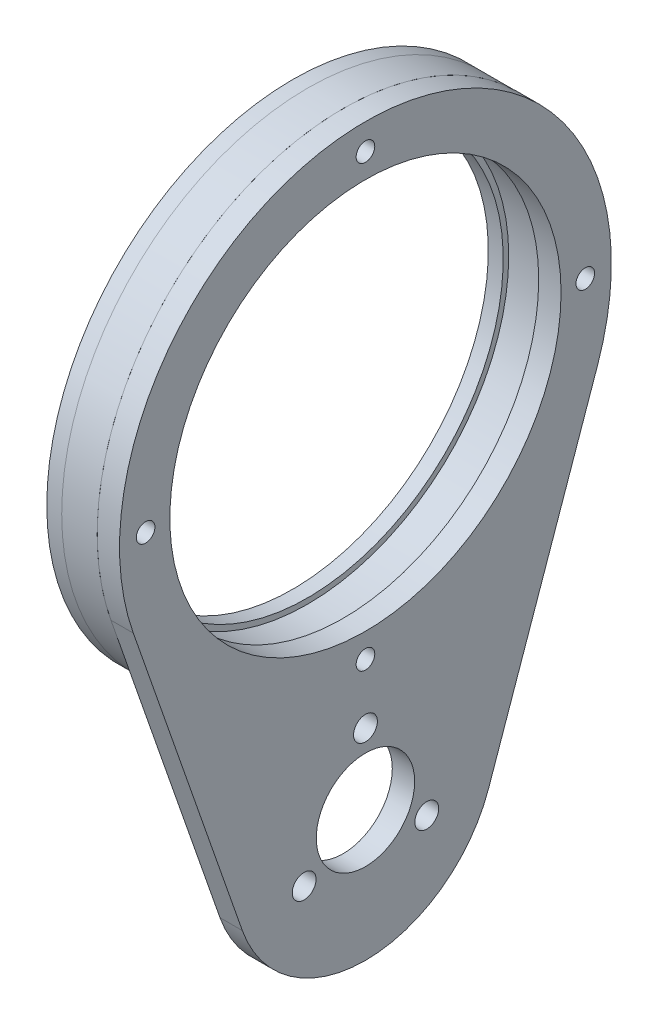
ISO-10303-21;
HEADER;
FILE_DESCRIPTION(('STEP AP214'),'2;1');
FILE_NAME('part.step','',(''),(''),'','','');
FILE_SCHEMA(('AUTOMOTIVE_DESIGN { 1 0 10303 214 1 1 1 1 }'));
ENDSEC;
DATA;
#1=APPLICATION_CONTEXT('core data for automotive mechanical design processes');
#2=APPLICATION_PROTOCOL_DEFINITION('international standard','automotive_design',2000,#1);
#3=PRODUCT_CONTEXT('',#1,'mechanical');
#4=PRODUCT('Part','Part','',(#3));
#5=PRODUCT_RELATED_PRODUCT_CATEGORY('part','',(#4));
#6=PRODUCT_DEFINITION_FORMATION('','',#4);
#7=PRODUCT_DEFINITION_CONTEXT('part definition',#1,'design');
#8=PRODUCT_DEFINITION('design','',#6,#7);
#9=PRODUCT_DEFINITION_SHAPE('','',#8);
#10=(LENGTH_UNIT() NAMED_UNIT(*) SI_UNIT(.MILLI.,.METRE.));
#11=(NAMED_UNIT(*) PLANE_ANGLE_UNIT() SI_UNIT($,.RADIAN.));
#12=(NAMED_UNIT(*) SI_UNIT($,.STERADIAN.) SOLID_ANGLE_UNIT());
#13=UNCERTAINTY_MEASURE_WITH_UNIT(LENGTH_MEASURE(1.E-05),#10,'distance_accuracy_value','');
#14=(GEOMETRIC_REPRESENTATION_CONTEXT(3) GLOBAL_UNCERTAINTY_ASSIGNED_CONTEXT((#13)) GLOBAL_UNIT_ASSIGNED_CONTEXT((#10,
#11,#12)) REPRESENTATION_CONTEXT('',''));
#15=CARTESIAN_POINT('',(0.,0.,0.));
#16=DIRECTION('',(0.,0.,1.));
#17=DIRECTION('',(1.,0.,0.));
#18=AXIS2_PLACEMENT_3D('',#15,#16,#17);
#19=CARTESIAN_POINT('',(-6.763,47.,0.));
#20=DIRECTION('',(-1.,0.,0.));
#21=DIRECTION('',(0.,0.,1.));
#22=AXIS2_PLACEMENT_3D('',#19,#20,#21);
#23=PLANE('',#22);
#24=CARTESIAN_POINT('',(-6.763,47.,-29.5));
#25=DIRECTION('',(-1.,0.,0.));
#26=DIRECTION('',(0.,0.,1.));
#27=AXIS2_PLACEMENT_3D('',#24,#25,#26);
#28=CIRCLE('',#27,1.60000000000001);
#29=CARTESIAN_POINT('',(-6.763,47.,-27.9));
#30=VERTEX_POINT('',#29);
#31=EDGE_CURVE('E74',#30,#30,#28,.T.);
#32=ORIENTED_EDGE('',*,*,#31,.F.);
#33=EDGE_LOOP('',(#32));
#34=FACE_BOUND('',#33,.T.);
#35=CARTESIAN_POINT('',(-6.763,17.5,0.));
#36=DIRECTION('',(-1.,0.,0.));
#37=DIRECTION('',(0.,0.,1.));
#38=AXIS2_PLACEMENT_3D('',#35,#36,#37);
#39=CIRCLE('',#38,1.6);
#40=CARTESIAN_POINT('',(-6.763,17.5,1.6));
#41=VERTEX_POINT('',#40);
#42=EDGE_CURVE('E62',#41,#41,#39,.T.);
#43=ORIENTED_EDGE('',*,*,#42,.F.);
#44=EDGE_LOOP('',(#43));
#45=FACE_BOUND('',#44,.T.);
#46=CARTESIAN_POINT('',(-6.763,47.,0.));
#47=DIRECTION('',(-1.,0.,0.));
#48=DIRECTION('',(0.,0.,1.));
#49=AXIS2_PLACEMENT_3D('',#46,#47,#48);
#50=CIRCLE('',#49,33.);
#51=CARTESIAN_POINT('',(-6.763,47.,33.));
#52=VERTEX_POINT('',#51);
#53=EDGE_CURVE('E11',#52,#52,#50,.T.);
#54=ORIENTED_EDGE('',*,*,#53,.T.);
#55=EDGE_LOOP('',(#54));
#56=FACE_BOUND('',#55,.T.);
#57=CARTESIAN_POINT('',(-6.763,47.,0.));
#58=DIRECTION('',(-1.,0.,0.));
#59=DIRECTION('',(0.,0.,1.));
#60=AXIS2_PLACEMENT_3D('',#57,#58,#59);
#61=CIRCLE('',#60,26.25);
#62=CARTESIAN_POINT('',(-6.763,47.,26.25));
#63=VERTEX_POINT('',#62);
#64=EDGE_CURVE('E57',#63,#63,#61,.T.);
#65=ORIENTED_EDGE('',*,*,#64,.F.);
#66=EDGE_LOOP('',(#65));
#67=FACE_BOUND('',#66,.T.);
#68=CARTESIAN_POINT('',(-6.763,47.,29.5));
#69=DIRECTION('',(-1.,0.,0.));
#70=DIRECTION('',(0.,0.,1.));
#71=AXIS2_PLACEMENT_3D('',#68,#69,#70);
#72=CIRCLE('',#71,1.60000000000001);
#73=CARTESIAN_POINT('',(-6.763,47.,31.1));
#74=VERTEX_POINT('',#73);
#75=EDGE_CURVE('E68',#74,#74,#72,.T.);
#76=ORIENTED_EDGE('',*,*,#75,.F.);
#77=EDGE_LOOP('',(#76));
#78=FACE_BOUND('',#77,.T.);
#79=CARTESIAN_POINT('',(-6.763,76.5,0.));
#80=DIRECTION('',(-1.,0.,0.));
#81=DIRECTION('',(0.,0.,1.));
#82=AXIS2_PLACEMENT_3D('',#79,#80,#81);
#83=CIRCLE('',#82,1.60000000000001);
#84=CARTESIAN_POINT('',(-6.763,76.5,1.60000000000001));
#85=VERTEX_POINT('',#84);
#86=EDGE_CURVE('E80',#85,#85,#83,.T.);
#87=ORIENTED_EDGE('',*,*,#86,.F.);
#88=EDGE_LOOP('',(#87));
#89=FACE_BOUND('',#88,.T.);
#90=ADVANCED_FACE('F46',(#34,#45,#56,#67,#78,#89),#23,.T.);
#91=CARTESIAN_POINT('',(-4.763,47.,0.));
#92=DIRECTION('',(-1.,0.,0.));
#93=DIRECTION('',(0.,0.,1.));
#94=AXIS2_PLACEMENT_3D('',#91,#92,#93);
#95=PLANE('',#94);
#96=CARTESIAN_POINT('',(-4.763,47.,0.));
#97=DIRECTION('',(-1.,0.,0.));
#98=DIRECTION('',(0.,0.,1.));
#99=AXIS2_PLACEMENT_3D('',#96,#97,#98);
#100=CIRCLE('',#99,33.);
#101=CARTESIAN_POINT('',(-4.763,47.,33.));
#102=VERTEX_POINT('',#101);
#103=EDGE_CURVE('E50',#102,#102,#100,.T.);
#104=ORIENTED_EDGE('',*,*,#103,.F.);
#105=EDGE_LOOP('',(#104));
#106=FACE_BOUND('',#105,.T.);
#107=CARTESIAN_POINT('',(-4.763,47.,0.));
#108=DIRECTION('',(-1.,0.,0.));
#109=DIRECTION('',(0.,0.,1.));
#110=AXIS2_PLACEMENT_3D('',#107,#108,#109);
#111=CIRCLE('',#110,26.25);
#112=CARTESIAN_POINT('',(-4.763,47.,26.25));
#113=VERTEX_POINT('',#112);
#114=EDGE_CURVE('E59',#113,#113,#111,.T.);
#115=ORIENTED_EDGE('',*,*,#114,.T.);
#116=EDGE_LOOP('',(#115));
#117=FACE_BOUND('',#116,.T.);
#118=CARTESIAN_POINT('',(-4.763,17.5,0.));
#119=DIRECTION('',(-1.,0.,0.));
#120=DIRECTION('',(0.,0.,1.));
#121=AXIS2_PLACEMENT_3D('',#118,#119,#120);
#122=CIRCLE('',#121,1.6);
#123=CARTESIAN_POINT('',(-4.763,17.5,1.6));
#124=VERTEX_POINT('',#123);
#125=EDGE_CURVE('E65',#124,#124,#122,.T.);
#126=ORIENTED_EDGE('',*,*,#125,.T.);
#127=EDGE_LOOP('',(#126));
#128=FACE_BOUND('',#127,.T.);
#129=CARTESIAN_POINT('',(-4.763,47.,29.5));
#130=DIRECTION('',(-1.,0.,0.));
#131=DIRECTION('',(0.,0.,1.));
#132=AXIS2_PLACEMENT_3D('',#129,#130,#131);
#133=CIRCLE('',#132,1.60000000000001);
#134=CARTESIAN_POINT('',(-4.763,47.,31.1));
#135=VERTEX_POINT('',#134);
#136=EDGE_CURVE('E71',#135,#135,#133,.T.);
#137=ORIENTED_EDGE('',*,*,#136,.T.);
#138=EDGE_LOOP('',(#137));
#139=FACE_BOUND('',#138,.T.);
#140=CARTESIAN_POINT('',(-4.763,47.,-29.5));
#141=DIRECTION('',(-1.,0.,0.));
#142=DIRECTION('',(0.,0.,1.));
#143=AXIS2_PLACEMENT_3D('',#140,#141,#142);
#144=CIRCLE('',#143,1.60000000000001);
#145=CARTESIAN_POINT('',(-4.763,47.,-27.9));
#146=VERTEX_POINT('',#145);
#147=EDGE_CURVE('E77',#146,#146,#144,.T.);
#148=ORIENTED_EDGE('',*,*,#147,.T.);
#149=EDGE_LOOP('',(#148));
#150=FACE_BOUND('',#149,.T.);
#151=CARTESIAN_POINT('',(-4.763,76.5,0.));
#152=DIRECTION('',(-1.,0.,0.));
#153=DIRECTION('',(0.,0.,1.));
#154=AXIS2_PLACEMENT_3D('',#151,#152,#153);
#155=CIRCLE('',#154,1.60000000000001);
#156=CARTESIAN_POINT('',(-4.763,76.5,1.60000000000001));
#157=VERTEX_POINT('',#156);
#158=EDGE_CURVE('E83',#157,#157,#155,.T.);
#159=ORIENTED_EDGE('',*,*,#158,.T.);
#160=EDGE_LOOP('',(#159));
#161=FACE_BOUND('',#160,.T.);
#162=ADVANCED_FACE('F93',(#106,#117,#128,#139,#150,#161),#95,.F.);
#163=CARTESIAN_POINT('',(-6.763,47.,0.));
#164=DIRECTION('',(1.,0.,0.));
#165=DIRECTION('',(0.,0.,-1.));
#166=AXIS2_PLACEMENT_3D('',#163,#164,#165);
#167=CYLINDRICAL_SURFACE('',#166,33.);
#168=ORIENTED_EDGE('',*,*,#53,.F.);
#169=EDGE_LOOP('',(#168));
#170=FACE_BOUND('',#169,.T.);
#171=ORIENTED_EDGE('',*,*,#103,.T.);
#172=EDGE_LOOP('',(#171));
#173=FACE_BOUND('',#172,.T.);
#174=ADVANCED_FACE('F48',(#170,#173),#167,.T.);
#175=CARTESIAN_POINT('',(-6.763,47.,0.));
#176=DIRECTION('',(1.,0.,0.));
#177=DIRECTION('',(0.,0.,-1.));
#178=AXIS2_PLACEMENT_3D('',#175,#176,#177);
#179=CYLINDRICAL_SURFACE('',#178,26.25);
#180=ORIENTED_EDGE('',*,*,#64,.T.);
#181=EDGE_LOOP('',(#180));
#182=FACE_BOUND('',#181,.T.);
#183=ORIENTED_EDGE('',*,*,#114,.F.);
#184=EDGE_LOOP('',(#183));
#185=FACE_BOUND('',#184,.T.);
#186=ADVANCED_FACE('F103',(#182,#185),#179,.F.);
#187=CARTESIAN_POINT('',(-6.763,17.5,0.));
#188=DIRECTION('',(1.,0.,0.));
#189=DIRECTION('',(0.,0.,-1.));
#190=AXIS2_PLACEMENT_3D('',#187,#188,#189);
#191=CYLINDRICAL_SURFACE('',#190,1.6);
#192=ORIENTED_EDGE('',*,*,#42,.T.);
#193=EDGE_LOOP('',(#192));
#194=FACE_BOUND('',#193,.T.);
#195=ORIENTED_EDGE('',*,*,#125,.F.);
#196=EDGE_LOOP('',(#195));
#197=FACE_BOUND('',#196,.T.);
#198=ADVANCED_FACE('F106',(#194,#197),#191,.F.);
#199=CARTESIAN_POINT('',(-6.763,47.,29.5));
#200=DIRECTION('',(1.,0.,0.));
#201=DIRECTION('',(0.,0.,-1.));
#202=AXIS2_PLACEMENT_3D('',#199,#200,#201);
#203=CYLINDRICAL_SURFACE('',#202,1.60000000000001);
#204=ORIENTED_EDGE('',*,*,#75,.T.);
#205=EDGE_LOOP('',(#204));
#206=FACE_BOUND('',#205,.T.);
#207=ORIENTED_EDGE('',*,*,#136,.F.);
#208=EDGE_LOOP('',(#207));
#209=FACE_BOUND('',#208,.T.);
#210=ADVANCED_FACE('F110',(#206,#209),#203,.F.);
#211=CARTESIAN_POINT('',(-6.763,47.,-29.5));
#212=DIRECTION('',(1.,0.,0.));
#213=DIRECTION('',(0.,0.,-1.));
#214=AXIS2_PLACEMENT_3D('',#211,#212,#213);
#215=CYLINDRICAL_SURFACE('',#214,1.60000000000001);
#216=ORIENTED_EDGE('',*,*,#31,.T.);
#217=EDGE_LOOP('',(#216));
#218=FACE_BOUND('',#217,.T.);
#219=ORIENTED_EDGE('',*,*,#147,.F.);
#220=EDGE_LOOP('',(#219));
#221=FACE_BOUND('',#220,.T.);
#222=ADVANCED_FACE('F114',(#218,#221),#215,.F.);
#223=CARTESIAN_POINT('',(-6.763,76.5,0.));
#224=DIRECTION('',(1.,0.,0.));
#225=DIRECTION('',(0.,0.,-1.));
#226=AXIS2_PLACEMENT_3D('',#223,#224,#225);
#227=CYLINDRICAL_SURFACE('',#226,1.60000000000001);
#228=ORIENTED_EDGE('',*,*,#86,.T.);
#229=EDGE_LOOP('',(#228));
#230=FACE_BOUND('',#229,.T.);
#231=ORIENTED_EDGE('',*,*,#158,.F.);
#232=EDGE_LOOP('',(#231));
#233=FACE_BOUND('',#232,.T.);
#234=ADVANCED_FACE('F89',(#230,#233),#227,.F.);
#235=CLOSED_SHELL('',(#90,#162,#174,#186,#198,#210,#222,#234));
#236=MANIFOLD_SOLID_BREP('B2',#235);
#237=CARTESIAN_POINT('',(-4.763,47.,0.));
#238=DIRECTION('',(-1.,0.,0.));
#239=DIRECTION('',(0.,0.,1.));
#240=AXIS2_PLACEMENT_3D('',#237,#238,#239);
#241=PLANE('',#240);
#242=CARTESIAN_POINT('',(-4.763,17.5,0.));
#243=DIRECTION('',(-1.,0.,0.));
#244=DIRECTION('',(0.,0.,1.));
#245=AXIS2_PLACEMENT_3D('',#242,#243,#244);
#246=CIRCLE('',#245,1.6);
#247=CARTESIAN_POINT('',(-4.763,17.5,1.6));
#248=VERTEX_POINT('',#247);
#249=EDGE_CURVE('E229',#248,#248,#246,.T.);
#250=ORIENTED_EDGE('',*,*,#249,.F.);
#251=EDGE_LOOP('',(#250));
#252=FACE_BOUND('',#251,.T.);
#253=CARTESIAN_POINT('',(-4.763,76.5,0.));
#254=DIRECTION('',(-1.,0.,0.));
#255=DIRECTION('',(0.,0.,1.));
#256=AXIS2_PLACEMENT_3D('',#253,#254,#255);
#257=CIRCLE('',#256,1.60000000000001);
#258=CARTESIAN_POINT('',(-4.763,76.5,1.60000000000001));
#259=VERTEX_POINT('',#258);
#260=EDGE_CURVE('E217',#259,#259,#257,.T.);
#261=ORIENTED_EDGE('',*,*,#260,.F.);
#262=EDGE_LOOP('',(#261));
#263=FACE_BOUND('',#262,.T.);
#264=CARTESIAN_POINT('',(-4.763,47.,0.));
#265=DIRECTION('',(-1.,0.,0.));
#266=DIRECTION('',(0.,0.,1.));
#267=AXIS2_PLACEMENT_3D('',#264,#265,#266);
#268=CIRCLE('',#267,33.);
#269=CARTESIAN_POINT('',(-4.763,47.,33.));
#270=VERTEX_POINT('',#269);
#271=EDGE_CURVE('E45',#270,#270,#268,.T.);
#272=ORIENTED_EDGE('',*,*,#271,.T.);
#273=EDGE_LOOP('',(#272));
#274=FACE_BOUND('',#273,.T.);
#275=CARTESIAN_POINT('',(-4.763,47.,0.));
#276=DIRECTION('',(-1.,0.,0.));
#277=DIRECTION('',(0.,0.,1.));
#278=AXIS2_PLACEMENT_3D('',#275,#276,#277);
#279=CIRCLE('',#278,26.9875);
#280=CARTESIAN_POINT('',(-4.763,47.,26.9875));
#281=VERTEX_POINT('',#280);
#282=EDGE_CURVE('E212',#281,#281,#279,.T.);
#283=ORIENTED_EDGE('',*,*,#282,.F.);
#284=EDGE_LOOP('',(#283));
#285=FACE_BOUND('',#284,.T.);
#286=CARTESIAN_POINT('',(-4.763,47.,29.5));
#287=DIRECTION('',(-1.,0.,0.));
#288=DIRECTION('',(0.,0.,1.));
#289=AXIS2_PLACEMENT_3D('',#286,#287,#288);
#290=CIRCLE('',#289,1.60000000000001);
#291=CARTESIAN_POINT('',(-4.763,47.,31.1));
#292=VERTEX_POINT('',#291);
#293=EDGE_CURVE('E223',#292,#292,#290,.T.);
#294=ORIENTED_EDGE('',*,*,#293,.F.);
#295=EDGE_LOOP('',(#294));
#296=FACE_BOUND('',#295,.T.);
#297=CARTESIAN_POINT('',(-4.763,47.,-29.5));
#298=DIRECTION('',(-1.,0.,0.));
#299=DIRECTION('',(0.,0.,1.));
#300=AXIS2_PLACEMENT_3D('',#297,#298,#299);
#301=CIRCLE('',#300,1.60000000000001);
#302=CARTESIAN_POINT('',(-4.763,47.,-27.9));
#303=VERTEX_POINT('',#302);
#304=EDGE_CURVE('E235',#303,#303,#301,.T.);
#305=ORIENTED_EDGE('',*,*,#304,.F.);
#306=EDGE_LOOP('',(#305));
#307=FACE_BOUND('',#306,.T.);
#308=ADVANCED_FACE('F201',(#252,#263,#274,#285,#296,#307),#241,.T.);
#309=CARTESIAN_POINT('',(0.,47.,0.));
#310=DIRECTION('',(-1.,0.,0.));
#311=DIRECTION('',(0.,0.,1.));
#312=AXIS2_PLACEMENT_3D('',#309,#310,#311);
#313=PLANE('',#312);
#314=CARTESIAN_POINT('',(0.,47.,0.));
#315=DIRECTION('',(-1.,0.,0.));
#316=DIRECTION('',(0.,0.,1.));
#317=AXIS2_PLACEMENT_3D('',#314,#315,#316);
#318=CIRCLE('',#317,33.);
#319=CARTESIAN_POINT('',(0.,47.,33.));
#320=VERTEX_POINT('',#319);
#321=EDGE_CURVE('E205',#320,#320,#318,.T.);
#322=ORIENTED_EDGE('',*,*,#321,.F.);
#323=EDGE_LOOP('',(#322));
#324=FACE_BOUND('',#323,.T.);
#325=CARTESIAN_POINT('',(0.,47.,0.));
#326=DIRECTION('',(-1.,0.,0.));
#327=DIRECTION('',(0.,0.,1.));
#328=AXIS2_PLACEMENT_3D('',#325,#326,#327);
#329=CIRCLE('',#328,26.9875);
#330=CARTESIAN_POINT('',(0.,47.,26.9875));
#331=VERTEX_POINT('',#330);
#332=EDGE_CURVE('E214',#331,#331,#329,.T.);
#333=ORIENTED_EDGE('',*,*,#332,.T.);
#334=EDGE_LOOP('',(#333));
#335=FACE_BOUND('',#334,.T.);
#336=CARTESIAN_POINT('',(0.,76.5,0.));
#337=DIRECTION('',(-1.,0.,0.));
#338=DIRECTION('',(0.,0.,1.));
#339=AXIS2_PLACEMENT_3D('',#336,#337,#338);
#340=CIRCLE('',#339,1.60000000000001);
#341=CARTESIAN_POINT('',(0.,76.5,1.60000000000001));
#342=VERTEX_POINT('',#341);
#343=EDGE_CURVE('E220',#342,#342,#340,.T.);
#344=ORIENTED_EDGE('',*,*,#343,.T.);
#345=EDGE_LOOP('',(#344));
#346=FACE_BOUND('',#345,.T.);
#347=CARTESIAN_POINT('',(0.,47.,29.5));
#348=DIRECTION('',(-1.,0.,0.));
#349=DIRECTION('',(0.,0.,1.));
#350=AXIS2_PLACEMENT_3D('',#347,#348,#349);
#351=CIRCLE('',#350,1.60000000000001);
#352=CARTESIAN_POINT('',(0.,47.,31.1));
#353=VERTEX_POINT('',#352);
#354=EDGE_CURVE('E226',#353,#353,#351,.T.);
#355=ORIENTED_EDGE('',*,*,#354,.T.);
#356=EDGE_LOOP('',(#355));
#357=FACE_BOUND('',#356,.T.);
#358=CARTESIAN_POINT('',(0.,17.5,0.));
#359=DIRECTION('',(-1.,0.,0.));
#360=DIRECTION('',(0.,0.,1.));
#361=AXIS2_PLACEMENT_3D('',#358,#359,#360);
#362=CIRCLE('',#361,1.6);
#363=CARTESIAN_POINT('',(0.,17.5,1.6));
#364=VERTEX_POINT('',#363);
#365=EDGE_CURVE('E232',#364,#364,#362,.T.);
#366=ORIENTED_EDGE('',*,*,#365,.T.);
#367=EDGE_LOOP('',(#366));
#368=FACE_BOUND('',#367,.T.);
#369=CARTESIAN_POINT('',(0.,47.,-29.5));
#370=DIRECTION('',(-1.,0.,0.));
#371=DIRECTION('',(0.,0.,1.));
#372=AXIS2_PLACEMENT_3D('',#369,#370,#371);
#373=CIRCLE('',#372,1.60000000000001);
#374=CARTESIAN_POINT('',(0.,47.,-27.9));
#375=VERTEX_POINT('',#374);
#376=EDGE_CURVE('E238',#375,#375,#373,.T.);
#377=ORIENTED_EDGE('',*,*,#376,.T.);
#378=EDGE_LOOP('',(#377));
#379=FACE_BOUND('',#378,.T.);
#380=ADVANCED_FACE('F248',(#324,#335,#346,#357,#368,#379),#313,.F.);
#381=CARTESIAN_POINT('',(-4.763,47.,0.));
#382=DIRECTION('',(1.,0.,0.));
#383=DIRECTION('',(0.,0.,-1.));
#384=AXIS2_PLACEMENT_3D('',#381,#382,#383);
#385=CYLINDRICAL_SURFACE('',#384,33.);
#386=ORIENTED_EDGE('',*,*,#271,.F.);
#387=EDGE_LOOP('',(#386));
#388=FACE_BOUND('',#387,.T.);
#389=ORIENTED_EDGE('',*,*,#321,.T.);
#390=EDGE_LOOP('',(#389));
#391=FACE_BOUND('',#390,.T.);
#392=ADVANCED_FACE('F203',(#388,#391),#385,.T.);
#393=CARTESIAN_POINT('',(-4.763,47.,0.));
#394=DIRECTION('',(1.,0.,0.));
#395=DIRECTION('',(0.,0.,-1.));
#396=AXIS2_PLACEMENT_3D('',#393,#394,#395);
#397=CYLINDRICAL_SURFACE('',#396,26.9875);
#398=ORIENTED_EDGE('',*,*,#282,.T.);
#399=EDGE_LOOP('',(#398));
#400=FACE_BOUND('',#399,.T.);
#401=ORIENTED_EDGE('',*,*,#332,.F.);
#402=EDGE_LOOP('',(#401));
#403=FACE_BOUND('',#402,.T.);
#404=ADVANCED_FACE('F258',(#400,#403),#397,.F.);
#405=CARTESIAN_POINT('',(-4.763,76.5,0.));
#406=DIRECTION('',(1.,0.,0.));
#407=DIRECTION('',(0.,0.,-1.));
#408=AXIS2_PLACEMENT_3D('',#405,#406,#407);
#409=CYLINDRICAL_SURFACE('',#408,1.60000000000001);
#410=ORIENTED_EDGE('',*,*,#260,.T.);
#411=EDGE_LOOP('',(#410));
#412=FACE_BOUND('',#411,.T.);
#413=ORIENTED_EDGE('',*,*,#343,.F.);
#414=EDGE_LOOP('',(#413));
#415=FACE_BOUND('',#414,.T.);
#416=ADVANCED_FACE('F261',(#412,#415),#409,.F.);
#417=CARTESIAN_POINT('',(-4.763,47.,29.5));
#418=DIRECTION('',(1.,0.,0.));
#419=DIRECTION('',(0.,0.,-1.));
#420=AXIS2_PLACEMENT_3D('',#417,#418,#419);
#421=CYLINDRICAL_SURFACE('',#420,1.60000000000001);
#422=ORIENTED_EDGE('',*,*,#293,.T.);
#423=EDGE_LOOP('',(#422));
#424=FACE_BOUND('',#423,.T.);
#425=ORIENTED_EDGE('',*,*,#354,.F.);
#426=EDGE_LOOP('',(#425));
#427=FACE_BOUND('',#426,.T.);
#428=ADVANCED_FACE('F265',(#424,#427),#421,.F.);
#429=CARTESIAN_POINT('',(-4.763,17.5,0.));
#430=DIRECTION('',(1.,0.,0.));
#431=DIRECTION('',(0.,0.,-1.));
#432=AXIS2_PLACEMENT_3D('',#429,#430,#431);
#433=CYLINDRICAL_SURFACE('',#432,1.6);
#434=ORIENTED_EDGE('',*,*,#249,.T.);
#435=EDGE_LOOP('',(#434));
#436=FACE_BOUND('',#435,.T.);
#437=ORIENTED_EDGE('',*,*,#365,.F.);
#438=EDGE_LOOP('',(#437));
#439=FACE_BOUND('',#438,.T.);
#440=ADVANCED_FACE('F269',(#436,#439),#433,.F.);
#441=CARTESIAN_POINT('',(-4.763,47.,-29.5));
#442=DIRECTION('',(1.,0.,0.));
#443=DIRECTION('',(0.,0.,-1.));
#444=AXIS2_PLACEMENT_3D('',#441,#442,#443);
#445=CYLINDRICAL_SURFACE('',#444,1.60000000000001);
#446=ORIENTED_EDGE('',*,*,#304,.T.);
#447=EDGE_LOOP('',(#446));
#448=FACE_BOUND('',#447,.T.);
#449=ORIENTED_EDGE('',*,*,#376,.F.);
#450=EDGE_LOOP('',(#449));
#451=FACE_BOUND('',#450,.T.);
#452=ADVANCED_FACE('F244',(#448,#451),#445,.F.);
#453=CLOSED_SHELL('',(#308,#380,#392,#404,#416,#428,#440,#452));
#454=MANIFOLD_SOLID_BREP('B6',#453);
#455=CARTESIAN_POINT('',(3.,47.,0.));
#456=DIRECTION('',(1.,0.,0.));
#457=DIRECTION('',(0.,0.,-1.));
#458=AXIS2_PLACEMENT_3D('',#455,#456,#457);
#459=PLANE('',#458);
#460=CARTESIAN_POINT('',(3.,47.,-29.5));
#461=DIRECTION('',(1.,0.,0.));
#462=DIRECTION('',(0.,0.,-1.));
#463=AXIS2_PLACEMENT_3D('',#460,#461,#462);
#464=CIRCLE('',#463,1.25);
#465=CARTESIAN_POINT('',(3.,47.,-30.75));
#466=VERTEX_POINT('',#465);
#467=EDGE_CURVE('E465',#466,#466,#464,.T.);
#468=ORIENTED_EDGE('',*,*,#467,.F.);
#469=EDGE_LOOP('',(#468));
#470=FACE_BOUND('',#469,.T.);
#471=CARTESIAN_POINT('',(3.,76.5,0.));
#472=DIRECTION('',(1.,0.,0.));
#473=DIRECTION('',(0.,0.,-1.));
#474=AXIS2_PLACEMENT_3D('',#471,#472,#473);
#475=CIRCLE('',#474,1.25);
#476=CARTESIAN_POINT('',(3.,76.5,-1.25));
#477=VERTEX_POINT('',#476);
#478=EDGE_CURVE('E453',#477,#477,#475,.T.);
#479=ORIENTED_EDGE('',*,*,#478,.F.);
#480=EDGE_LOOP('',(#479));
#481=FACE_BOUND('',#480,.T.);
#482=CARTESIAN_POINT('',(3.,-4.75,8.22724133595217));
#483=DIRECTION('',(1.,0.,0.));
#484=DIRECTION('',(0.,0.,-1.));
#485=AXIS2_PLACEMENT_3D('',#482,#483,#484);
#486=CIRCLE('',#485,1.6);
#487=CARTESIAN_POINT('',(3.,-4.75,6.62724133595217));
#488=VERTEX_POINT('',#487);
#489=EDGE_CURVE('E441',#488,#488,#486,.T.);
#490=ORIENTED_EDGE('',*,*,#489,.F.);
#491=EDGE_LOOP('',(#490));
#492=FACE_BOUND('',#491,.T.);
#493=CARTESIAN_POINT('',(3.,9.5,0.));
#494=DIRECTION('',(1.,0.,0.));
#495=DIRECTION('',(0.,0.,-1.));
#496=AXIS2_PLACEMENT_3D('',#493,#494,#495);
#497=CIRCLE('',#496,1.6);
#498=CARTESIAN_POINT('',(3.,9.5,-1.6));
#499=VERTEX_POINT('',#498);
#500=EDGE_CURVE('E429',#499,#499,#497,.T.);
#501=ORIENTED_EDGE('',*,*,#500,.F.);
#502=EDGE_LOOP('',(#501));
#503=FACE_BOUND('',#502,.T.);
#504=CARTESIAN_POINT('',(3.,47.,0.));
#505=DIRECTION('',(1.,0.,0.));
#506=DIRECTION('',(0.,0.,-1.));
#507=AXIS2_PLACEMENT_3D('',#504,#505,#506);
#508=CIRCLE('',#507,33.);
#509=CARTESIAN_POINT('',(3.,36.1170212765957,-31.1538243897267));
#510=VERTEX_POINT('',#509);
#511=CARTESIAN_POINT('',(3.,36.1170212765957,31.1538243897267));
#512=VERTEX_POINT('',#511);
#513=EDGE_CURVE('E399',#510,#512,#508,.T.);
#514=ORIENTED_EDGE('',*,*,#513,.T.);
#515=DIRECTION('',(0.,-0.944055284537173,-0.329787234042554));
#516=VECTOR('',#515,1.);
#517=CARTESIAN_POINT('',(3.,36.1170212765957,31.1538243897267));
#518=LINE('',#517,#516);
#519=CARTESIAN_POINT('',(3.,-5.77127659574468,16.5209674794005));
#520=VERTEX_POINT('',#519);
#521=EDGE_CURVE('E394',#512,#520,#518,.T.);
#522=ORIENTED_EDGE('',*,*,#521,.T.);
#523=CARTESIAN_POINT('',(3.,0.,0.));
#524=DIRECTION('',(1.,0.,0.));
#525=DIRECTION('',(0.,0.,-1.));
#526=AXIS2_PLACEMENT_3D('',#523,#524,#525);
#527=CIRCLE('',#526,17.5);
#528=CARTESIAN_POINT('',(3.,-5.77127659574469,-16.5209674794005));
#529=VERTEX_POINT('',#528);
#530=EDGE_CURVE('E397',#520,#529,#527,.T.);
#531=ORIENTED_EDGE('',*,*,#530,.T.);
#532=DIRECTION('',(0.,0.944055284537173,-0.329787234042554));
#533=VECTOR('',#532,1.);
#534=CARTESIAN_POINT('',(3.,36.1170212765957,-31.1538243897267));
#535=LINE('',#534,#533);
#536=EDGE_CURVE('E364',#529,#510,#535,.T.);
#537=ORIENTED_EDGE('',*,*,#536,.T.);
#538=EDGE_LOOP('',(#514,#522,#531,#537));
#539=FACE_BOUND('',#538,.T.);
#540=CARTESIAN_POINT('',(3.,0.,0.));
#541=DIRECTION('',(1.,0.,0.));
#542=DIRECTION('',(0.,0.,-1.));
#543=AXIS2_PLACEMENT_3D('',#540,#541,#542);
#544=CIRCLE('',#543,6.6);
#545=CARTESIAN_POINT('',(3.,0.,-6.6));
#546=VERTEX_POINT('',#545);
#547=EDGE_CURVE('E414',#546,#546,#544,.T.);
#548=ORIENTED_EDGE('',*,*,#547,.F.);
#549=EDGE_LOOP('',(#548));
#550=FACE_BOUND('',#549,.T.);
#551=CARTESIAN_POINT('',(3.,-4.75,-8.22724133595217));
#552=DIRECTION('',(1.,0.,0.));
#553=DIRECTION('',(0.,0.,-1.));
#554=AXIS2_PLACEMENT_3D('',#551,#552,#553);
#555=CIRCLE('',#554,1.6);
#556=CARTESIAN_POINT('',(3.,-4.75,-9.82724133595217));
#557=VERTEX_POINT('',#556);
#558=EDGE_CURVE('E435',#557,#557,#555,.T.);
#559=ORIENTED_EDGE('',*,*,#558,.F.);
#560=EDGE_LOOP('',(#559));
#561=FACE_BOUND('',#560,.T.);
#562=CARTESIAN_POINT('',(3.,47.,0.));
#563=DIRECTION('',(1.,0.,0.));
#564=DIRECTION('',(0.,0.,-1.));
#565=AXIS2_PLACEMENT_3D('',#562,#563,#564);
#566=CIRCLE('',#565,26.25);
#567=CARTESIAN_POINT('',(3.,47.,-26.25));
#568=VERTEX_POINT('',#567);
#569=EDGE_CURVE('E447',#568,#568,#566,.T.);
#570=ORIENTED_EDGE('',*,*,#569,.F.);
#571=EDGE_LOOP('',(#570));
#572=FACE_BOUND('',#571,.T.);
#573=CARTESIAN_POINT('',(3.,17.5,0.));
#574=DIRECTION('',(1.,0.,0.));
#575=DIRECTION('',(0.,0.,-1.));
#576=AXIS2_PLACEMENT_3D('',#573,#574,#575);
#577=CIRCLE('',#576,1.25);
#578=CARTESIAN_POINT('',(3.,17.5,-1.25));
#579=VERTEX_POINT('',#578);
#580=EDGE_CURVE('E459',#579,#579,#577,.T.);
#581=ORIENTED_EDGE('',*,*,#580,.F.);
#582=EDGE_LOOP('',(#581));
#583=FACE_BOUND('',#582,.T.);
#584=CARTESIAN_POINT('',(3.,47.,29.5));
#585=DIRECTION('',(1.,0.,0.));
#586=DIRECTION('',(0.,0.,-1.));
#587=AXIS2_PLACEMENT_3D('',#584,#585,#586);
#588=CIRCLE('',#587,1.25);
#589=CARTESIAN_POINT('',(3.,47.,28.25));
#590=VERTEX_POINT('',#589);
#591=EDGE_CURVE('E471',#590,#590,#588,.T.);
#592=ORIENTED_EDGE('',*,*,#591,.F.);
#593=EDGE_LOOP('',(#592));
#594=FACE_BOUND('',#593,.T.);
#595=ADVANCED_FACE('F347',(#470,#481,#492,#503,#539,#550,#561,#572,#583,#594),#459,.T.);
#596=CARTESIAN_POINT('',(0.,47.,0.));
#597=DIRECTION('',(1.,0.,0.));
#598=DIRECTION('',(0.,0.,-1.));
#599=AXIS2_PLACEMENT_3D('',#596,#597,#598);
#600=PLANE('',#599);
#601=CARTESIAN_POINT('',(0.,47.,0.));
#602=DIRECTION('',(1.,0.,0.));
#603=DIRECTION('',(0.,0.,-1.));
#604=AXIS2_PLACEMENT_3D('',#601,#602,#603);
#605=CIRCLE('',#604,33.);
#606=CARTESIAN_POINT('',(0.,36.1170212765957,-31.1538243897267));
#607=VERTEX_POINT('',#606);
#608=CARTESIAN_POINT('',(0.,36.1170212765957,31.1538243897267));
#609=VERTEX_POINT('',#608);
#610=EDGE_CURVE('E411',#607,#609,#605,.T.);
#611=ORIENTED_EDGE('',*,*,#610,.F.);
#612=DIRECTION('',(0.,0.944055284537173,-0.329787234042554));
#613=VECTOR('',#612,1.);
#614=CARTESIAN_POINT('',(0.,36.1170212765957,-31.1538243897267));
#615=LINE('',#614,#613);
#616=CARTESIAN_POINT('',(0.,-5.77127659574469,-16.5209674794005));
#617=VERTEX_POINT('',#616);
#618=EDGE_CURVE('E387',#617,#607,#615,.T.);
#619=ORIENTED_EDGE('',*,*,#618,.F.);
#620=CARTESIAN_POINT('',(0.,0.,0.));
#621=DIRECTION('',(1.,0.,0.));
#622=DIRECTION('',(0.,0.,-1.));
#623=AXIS2_PLACEMENT_3D('',#620,#621,#622);
#624=CIRCLE('',#623,17.5);
#625=CARTESIAN_POINT('',(0.,-5.77127659574468,16.5209674794005));
#626=VERTEX_POINT('',#625);
#627=EDGE_CURVE('E381',#626,#617,#624,.T.);
#628=ORIENTED_EDGE('',*,*,#627,.F.);
#629=DIRECTION('',(0.,-0.944055284537173,-0.329787234042554));
#630=VECTOR('',#629,1.);
#631=CARTESIAN_POINT('',(0.,36.1170212765957,31.1538243897267));
#632=LINE('',#631,#630);
#633=EDGE_CURVE('E403',#609,#626,#632,.T.);
#634=ORIENTED_EDGE('',*,*,#633,.F.);
#635=EDGE_LOOP('',(#611,#619,#628,#634));
#636=FACE_BOUND('',#635,.T.);
#637=CARTESIAN_POINT('',(0.,0.,0.));
#638=DIRECTION('',(1.,0.,0.));
#639=DIRECTION('',(0.,0.,-1.));
#640=AXIS2_PLACEMENT_3D('',#637,#638,#639);
#641=CIRCLE('',#640,6.6);
#642=CARTESIAN_POINT('',(0.,0.,-6.6));
#643=VERTEX_POINT('',#642);
#644=EDGE_CURVE('E426',#643,#643,#641,.T.);
#645=ORIENTED_EDGE('',*,*,#644,.T.);
#646=EDGE_LOOP('',(#645));
#647=FACE_BOUND('',#646,.T.);
#648=CARTESIAN_POINT('',(0.,9.5,0.));
#649=DIRECTION('',(1.,0.,0.));
#650=DIRECTION('',(0.,0.,-1.));
#651=AXIS2_PLACEMENT_3D('',#648,#649,#650);
#652=CIRCLE('',#651,1.6);
#653=CARTESIAN_POINT('',(0.,9.5,-1.6));
#654=VERTEX_POINT('',#653);
#655=EDGE_CURVE('E432',#654,#654,#652,.T.);
#656=ORIENTED_EDGE('',*,*,#655,.T.);
#657=EDGE_LOOP('',(#656));
#658=FACE_BOUND('',#657,.T.);
#659=CARTESIAN_POINT('',(0.,-4.75,-8.22724133595217));
#660=DIRECTION('',(1.,0.,0.));
#661=DIRECTION('',(0.,0.,-1.));
#662=AXIS2_PLACEMENT_3D('',#659,#660,#661);
#663=CIRCLE('',#662,1.6);
#664=CARTESIAN_POINT('',(0.,-4.75,-9.82724133595217));
#665=VERTEX_POINT('',#664);
#666=EDGE_CURVE('E438',#665,#665,#663,.T.);
#667=ORIENTED_EDGE('',*,*,#666,.T.);
#668=EDGE_LOOP('',(#667));
#669=FACE_BOUND('',#668,.T.);
#670=CARTESIAN_POINT('',(0.,-4.75,8.22724133595217));
#671=DIRECTION('',(1.,0.,0.));
#672=DIRECTION('',(0.,0.,-1.));
#673=AXIS2_PLACEMENT_3D('',#670,#671,#672);
#674=CIRCLE('',#673,1.6);
#675=CARTESIAN_POINT('',(0.,-4.75,6.62724133595217));
#676=VERTEX_POINT('',#675);
#677=EDGE_CURVE('E444',#676,#676,#674,.T.);
#678=ORIENTED_EDGE('',*,*,#677,.T.);
#679=EDGE_LOOP('',(#678));
#680=FACE_BOUND('',#679,.T.);
#681=CARTESIAN_POINT('',(0.,47.,0.));
#682=DIRECTION('',(1.,0.,0.));
#683=DIRECTION('',(0.,0.,-1.));
#684=AXIS2_PLACEMENT_3D('',#681,#682,#683);
#685=CIRCLE('',#684,26.25);
#686=CARTESIAN_POINT('',(0.,47.,-26.25));
#687=VERTEX_POINT('',#686);
#688=EDGE_CURVE('E450',#687,#687,#685,.T.);
#689=ORIENTED_EDGE('',*,*,#688,.T.);
#690=EDGE_LOOP('',(#689));
#691=FACE_BOUND('',#690,.T.);
#692=CARTESIAN_POINT('',(0.,76.5,0.));
#693=DIRECTION('',(1.,0.,0.));
#694=DIRECTION('',(0.,0.,-1.));
#695=AXIS2_PLACEMENT_3D('',#692,#693,#694);
#696=CIRCLE('',#695,1.25);
#697=CARTESIAN_POINT('',(0.,76.5,-1.25));
#698=VERTEX_POINT('',#697);
#699=EDGE_CURVE('E456',#698,#698,#696,.T.);
#700=ORIENTED_EDGE('',*,*,#699,.T.);
#701=EDGE_LOOP('',(#700));
#702=FACE_BOUND('',#701,.T.);
#703=CARTESIAN_POINT('',(0.,17.5,0.));
#704=DIRECTION('',(1.,0.,0.));
#705=DIRECTION('',(0.,0.,-1.));
#706=AXIS2_PLACEMENT_3D('',#703,#704,#705);
#707=CIRCLE('',#706,1.25);
#708=CARTESIAN_POINT('',(0.,17.5,-1.25));
#709=VERTEX_POINT('',#708);
#710=EDGE_CURVE('E462',#709,#709,#707,.T.);
#711=ORIENTED_EDGE('',*,*,#710,.T.);
#712=EDGE_LOOP('',(#711));
#713=FACE_BOUND('',#712,.T.);
#714=CARTESIAN_POINT('',(0.,47.,-29.5));
#715=DIRECTION('',(1.,0.,0.));
#716=DIRECTION('',(0.,0.,-1.));
#717=AXIS2_PLACEMENT_3D('',#714,#715,#716);
#718=CIRCLE('',#717,1.25);
#719=CARTESIAN_POINT('',(0.,47.,-30.75));
#720=VERTEX_POINT('',#719);
#721=EDGE_CURVE('E468',#720,#720,#718,.T.);
#722=ORIENTED_EDGE('',*,*,#721,.T.);
#723=EDGE_LOOP('',(#722));
#724=FACE_BOUND('',#723,.T.);
#725=CARTESIAN_POINT('',(0.,47.,29.5));
#726=DIRECTION('',(1.,0.,0.));
#727=DIRECTION('',(0.,0.,-1.));
#728=AXIS2_PLACEMENT_3D('',#725,#726,#727);
#729=CIRCLE('',#728,1.25);
#730=CARTESIAN_POINT('',(0.,47.,28.25));
#731=VERTEX_POINT('',#730);
#732=EDGE_CURVE('E474',#731,#731,#729,.T.);
#733=ORIENTED_EDGE('',*,*,#732,.T.);
#734=EDGE_LOOP('',(#733));
#735=FACE_BOUND('',#734,.T.);
#736=ADVANCED_FACE('F422',(#636,#647,#658,#669,#680,#691,#702,#713,#724,#735),#600,.F.);
#737=CARTESIAN_POINT('',(3.,47.,0.));
#738=DIRECTION('',(-1.,0.,0.));
#739=DIRECTION('',(0.,0.,1.));
#740=AXIS2_PLACEMENT_3D('',#737,#738,#739);
#741=CYLINDRICAL_SURFACE('',#740,33.);
#742=ORIENTED_EDGE('',*,*,#610,.T.);
#743=DIRECTION('',(-1.,0.,0.));
#744=VECTOR('',#743,1.);
#745=CARTESIAN_POINT('',(3.,36.1170212765957,31.1538243897267));
#746=LINE('',#745,#744);
#747=EDGE_CURVE('E199',#512,#609,#746,.T.);
#748=ORIENTED_EDGE('',*,*,#747,.F.);
#749=ORIENTED_EDGE('',*,*,#513,.F.);
#750=DIRECTION('',(-1.,0.,0.));
#751=VECTOR('',#750,1.);
#752=CARTESIAN_POINT('',(3.,36.1170212765957,-31.1538243897267));
#753=LINE('',#752,#751);
#754=EDGE_CURVE('E407',#510,#607,#753,.T.);
#755=ORIENTED_EDGE('',*,*,#754,.T.);
#756=EDGE_LOOP('',(#742,#748,#749,#755));
#757=FACE_BOUND('',#756,.T.);
#758=ADVANCED_FACE('F349',(#757),#741,.T.);
#759=CARTESIAN_POINT('',(3.,36.1170212765957,31.1538243897267));
#760=DIRECTION('',(0.,0.329787234042554,-0.944055284537173));
#761=DIRECTION('',(0.,0.944055284537173,0.329787234042554));
#762=AXIS2_PLACEMENT_3D('',#759,#760,#761);
#763=PLANE('',#762);
#764=ORIENTED_EDGE('',*,*,#633,.T.);
#765=DIRECTION('',(-1.,0.,0.));
#766=VECTOR('',#765,1.);
#767=CARTESIAN_POINT('',(3.,-5.77127659574468,16.5209674794005));
#768=LINE('',#767,#766);
#769=EDGE_CURVE('E356',#520,#626,#768,.T.);
#770=ORIENTED_EDGE('',*,*,#769,.F.);
#771=ORIENTED_EDGE('',*,*,#521,.F.);
#772=ORIENTED_EDGE('',*,*,#747,.T.);
#773=EDGE_LOOP('',(#764,#770,#771,#772));
#774=FACE_BOUND('',#773,.T.);
#775=ADVANCED_FACE('F402',(#774),#763,.F.);
#776=CARTESIAN_POINT('',(3.,0.,0.));
#777=DIRECTION('',(-1.,0.,0.));
#778=DIRECTION('',(0.,0.,1.));
#779=AXIS2_PLACEMENT_3D('',#776,#777,#778);
#780=CYLINDRICAL_SURFACE('',#779,17.5);
#781=ORIENTED_EDGE('',*,*,#627,.T.);
#782=DIRECTION('',(-1.,0.,0.));
#783=VECTOR('',#782,1.);
#784=CARTESIAN_POINT('',(3.,-5.77127659574469,-16.5209674794005));
#785=LINE('',#784,#783);
#786=EDGE_CURVE('E404',#529,#617,#785,.T.);
#787=ORIENTED_EDGE('',*,*,#786,.F.);
#788=ORIENTED_EDGE('',*,*,#530,.F.);
#789=ORIENTED_EDGE('',*,*,#769,.T.);
#790=EDGE_LOOP('',(#781,#787,#788,#789));
#791=FACE_BOUND('',#790,.T.);
#792=ADVANCED_FACE('F405',(#791),#780,.T.);
#793=CARTESIAN_POINT('',(3.,36.1170212765957,-31.1538243897267));
#794=DIRECTION('',(0.,0.329787234042554,0.944055284537173));
#795=DIRECTION('',(0.,-0.944055284537173,0.329787234042554));
#796=AXIS2_PLACEMENT_3D('',#793,#794,#795);
#797=PLANE('',#796);
#798=ORIENTED_EDGE('',*,*,#618,.T.);
#799=ORIENTED_EDGE('',*,*,#754,.F.);
#800=ORIENTED_EDGE('',*,*,#536,.F.);
#801=ORIENTED_EDGE('',*,*,#786,.T.);
#802=EDGE_LOOP('',(#798,#799,#800,#801));
#803=FACE_BOUND('',#802,.T.);
#804=ADVANCED_FACE('F419',(#803),#797,.F.);
#805=CARTESIAN_POINT('',(3.,0.,0.));
#806=DIRECTION('',(-1.,0.,0.));
#807=DIRECTION('',(0.,0.,1.));
#808=AXIS2_PLACEMENT_3D('',#805,#806,#807);
#809=CYLINDRICAL_SURFACE('',#808,6.6);
#810=ORIENTED_EDGE('',*,*,#547,.T.);
#811=EDGE_LOOP('',(#810));
#812=FACE_BOUND('',#811,.T.);
#813=ORIENTED_EDGE('',*,*,#644,.F.);
#814=EDGE_LOOP('',(#813));
#815=FACE_BOUND('',#814,.T.);
#816=ADVANCED_FACE('F493',(#812,#815),#809,.F.);
#817=CARTESIAN_POINT('',(3.,9.5,0.));
#818=DIRECTION('',(-1.,0.,0.));
#819=DIRECTION('',(0.,0.,1.));
#820=AXIS2_PLACEMENT_3D('',#817,#818,#819);
#821=CYLINDRICAL_SURFACE('',#820,1.6);
#822=ORIENTED_EDGE('',*,*,#500,.T.);
#823=EDGE_LOOP('',(#822));
#824=FACE_BOUND('',#823,.T.);
#825=ORIENTED_EDGE('',*,*,#655,.F.);
#826=EDGE_LOOP('',(#825));
#827=FACE_BOUND('',#826,.T.);
#828=ADVANCED_FACE('F539',(#824,#827),#821,.F.);
#829=CARTESIAN_POINT('',(3.,-4.75,-8.22724133595217));
#830=DIRECTION('',(-1.,0.,0.));
#831=DIRECTION('',(0.,0.,1.));
#832=AXIS2_PLACEMENT_3D('',#829,#830,#831);
#833=CYLINDRICAL_SURFACE('',#832,1.6);
#834=ORIENTED_EDGE('',*,*,#558,.T.);
#835=EDGE_LOOP('',(#834));
#836=FACE_BOUND('',#835,.T.);
#837=ORIENTED_EDGE('',*,*,#666,.F.);
#838=EDGE_LOOP('',(#837));
#839=FACE_BOUND('',#838,.T.);
#840=ADVANCED_FACE('F547',(#836,#839),#833,.F.);
#841=CARTESIAN_POINT('',(3.,-4.75,8.22724133595217));
#842=DIRECTION('',(-1.,0.,0.));
#843=DIRECTION('',(0.,0.,1.));
#844=AXIS2_PLACEMENT_3D('',#841,#842,#843);
#845=CYLINDRICAL_SURFACE('',#844,1.6);
#846=ORIENTED_EDGE('',*,*,#489,.T.);
#847=EDGE_LOOP('',(#846));
#848=FACE_BOUND('',#847,.T.);
#849=ORIENTED_EDGE('',*,*,#677,.F.);
#850=EDGE_LOOP('',(#849));
#851=FACE_BOUND('',#850,.T.);
#852=ADVANCED_FACE('F555',(#848,#851),#845,.F.);
#853=CARTESIAN_POINT('',(3.,47.,0.));
#854=DIRECTION('',(-1.,0.,0.));
#855=DIRECTION('',(0.,0.,1.));
#856=AXIS2_PLACEMENT_3D('',#853,#854,#855);
#857=CYLINDRICAL_SURFACE('',#856,26.25);
#858=ORIENTED_EDGE('',*,*,#569,.T.);
#859=EDGE_LOOP('',(#858));
#860=FACE_BOUND('',#859,.T.);
#861=ORIENTED_EDGE('',*,*,#688,.F.);
#862=EDGE_LOOP('',(#861));
#863=FACE_BOUND('',#862,.T.);
#864=ADVANCED_FACE('F564',(#860,#863),#857,.F.);
#865=CARTESIAN_POINT('',(3.,76.5,0.));
#866=DIRECTION('',(-1.,0.,0.));
#867=DIRECTION('',(0.,0.,1.));
#868=AXIS2_PLACEMENT_3D('',#865,#866,#867);
#869=CYLINDRICAL_SURFACE('',#868,1.25);
#870=ORIENTED_EDGE('',*,*,#478,.T.);
#871=EDGE_LOOP('',(#870));
#872=FACE_BOUND('',#871,.T.);
#873=ORIENTED_EDGE('',*,*,#699,.F.);
#874=EDGE_LOOP('',(#873));
#875=FACE_BOUND('',#874,.T.);
#876=ADVANCED_FACE('F573',(#872,#875),#869,.F.);
#877=CARTESIAN_POINT('',(3.,17.5,0.));
#878=DIRECTION('',(-1.,0.,0.));
#879=DIRECTION('',(0.,0.,1.));
#880=AXIS2_PLACEMENT_3D('',#877,#878,#879);
#881=CYLINDRICAL_SURFACE('',#880,1.25);
#882=ORIENTED_EDGE('',*,*,#580,.T.);
#883=EDGE_LOOP('',(#882));
#884=FACE_BOUND('',#883,.T.);
#885=ORIENTED_EDGE('',*,*,#710,.F.);
#886=EDGE_LOOP('',(#885));
#887=FACE_BOUND('',#886,.T.);
#888=ADVANCED_FACE('F582',(#884,#887),#881,.F.);
#889=CARTESIAN_POINT('',(3.,47.,-29.5));
#890=DIRECTION('',(-1.,0.,0.));
#891=DIRECTION('',(0.,0.,1.));
#892=AXIS2_PLACEMENT_3D('',#889,#890,#891);
#893=CYLINDRICAL_SURFACE('',#892,1.25);
#894=ORIENTED_EDGE('',*,*,#467,.T.);
#895=EDGE_LOOP('',(#894));
#896=FACE_BOUND('',#895,.T.);
#897=ORIENTED_EDGE('',*,*,#721,.F.);
#898=EDGE_LOOP('',(#897));
#899=FACE_BOUND('',#898,.T.);
#900=ADVANCED_FACE('F591',(#896,#899),#893,.F.);
#901=CARTESIAN_POINT('',(3.,47.,29.5));
#902=DIRECTION('',(-1.,0.,0.));
#903=DIRECTION('',(0.,0.,1.));
#904=AXIS2_PLACEMENT_3D('',#901,#902,#903);
#905=CYLINDRICAL_SURFACE('',#904,1.25);
#906=ORIENTED_EDGE('',*,*,#591,.T.);
#907=EDGE_LOOP('',(#906));
#908=FACE_BOUND('',#907,.T.);
#909=ORIENTED_EDGE('',*,*,#732,.F.);
#910=EDGE_LOOP('',(#909));
#911=FACE_BOUND('',#910,.T.);
#912=ADVANCED_FACE('F480',(#908,#911),#905,.F.);
#913=CLOSED_SHELL('',(#595,#736,#758,#775,#792,#804,#816,#828,#840,#852,#864,#876,#888,#900,#912));
#914=MANIFOLD_SOLID_BREP('B40',#913);
#915=ADVANCED_BREP_SHAPE_REPRESENTATION('',(#18,#236,#454,#914),#14);
#916=SHAPE_DEFINITION_REPRESENTATION(#9,#915);
ENDSEC;
END-ISO-10303-21;
